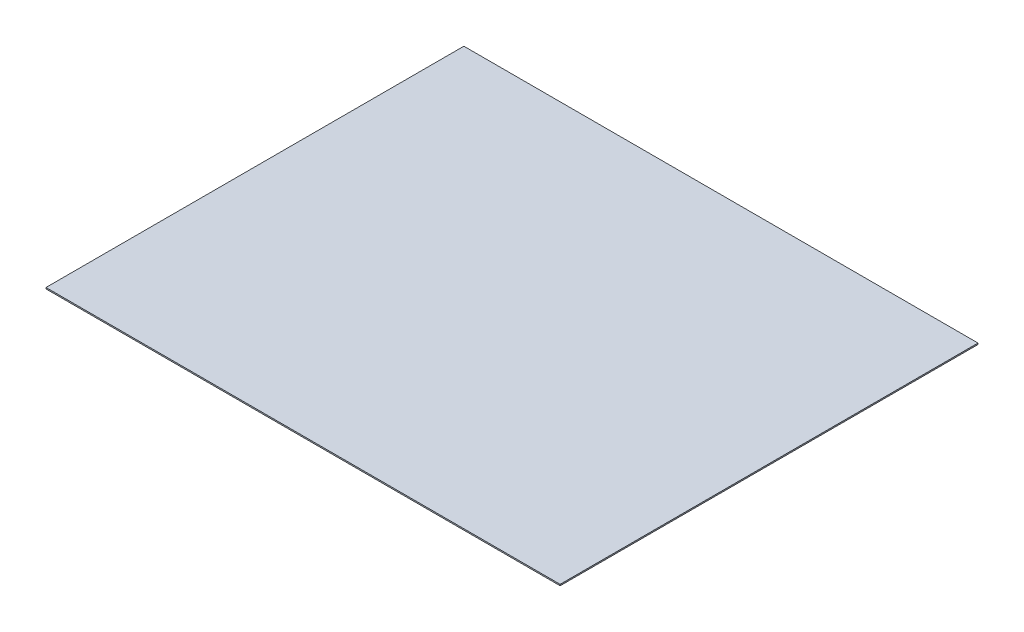
ISO-10303-21;
HEADER;
FILE_DESCRIPTION(('STEP AP214'),'2;1');
FILE_NAME('part.step','',(''),(''),'','','');
FILE_SCHEMA(('AUTOMOTIVE_DESIGN { 1 0 10303 214 1 1 1 1 }'));
ENDSEC;
DATA;
#1=APPLICATION_CONTEXT('core data for automotive mechanical design processes');
#2=APPLICATION_PROTOCOL_DEFINITION('international standard','automotive_design',2000,#1);
#3=PRODUCT_CONTEXT('',#1,'mechanical');
#4=PRODUCT('Part','Part','',(#3));
#5=PRODUCT_RELATED_PRODUCT_CATEGORY('part','',(#4));
#6=PRODUCT_DEFINITION_FORMATION('','',#4);
#7=PRODUCT_DEFINITION_CONTEXT('part definition',#1,'design');
#8=PRODUCT_DEFINITION('design','',#6,#7);
#9=PRODUCT_DEFINITION_SHAPE('','',#8);
#10=(LENGTH_UNIT() NAMED_UNIT(*) SI_UNIT(.MILLI.,.METRE.));
#11=(NAMED_UNIT(*) PLANE_ANGLE_UNIT() SI_UNIT($,.RADIAN.));
#12=(NAMED_UNIT(*) SI_UNIT($,.STERADIAN.) SOLID_ANGLE_UNIT());
#13=UNCERTAINTY_MEASURE_WITH_UNIT(LENGTH_MEASURE(1.E-05),#10,'distance_accuracy_value','');
#14=(GEOMETRIC_REPRESENTATION_CONTEXT(3) GLOBAL_UNCERTAINTY_ASSIGNED_CONTEXT((#13)) GLOBAL_UNIT_ASSIGNED_CONTEXT((#10,
#11,#12)) REPRESENTATION_CONTEXT('',''));
#15=CARTESIAN_POINT('',(0.,0.,0.));
#16=DIRECTION('',(0.,0.,1.));
#17=DIRECTION('',(1.,0.,0.));
#18=AXIS2_PLACEMENT_3D('',#15,#16,#17);
#19=CARTESIAN_POINT('',(0.,1.5875,0.));
#20=DIRECTION('',(1.,0.,0.));
#21=DIRECTION('',(0.,0.,-1.));
#22=AXIS2_PLACEMENT_3D('',#19,#20,#21);
#23=PLANE('',#22);
#24=DIRECTION('',(0.,0.,1.));
#25=VECTOR('',#24,1.);
#26=CARTESIAN_POINT('',(0.,0.,0.));
#27=LINE('',#26,#25);
#28=CARTESIAN_POINT('',(0.,0.,-508.46228));
#29=VERTEX_POINT('',#28);
#30=CARTESIAN_POINT('',(0.,0.,0.));
#31=VERTEX_POINT('',#30);
#32=EDGE_CURVE('E96',#29,#31,#27,.T.);
#33=ORIENTED_EDGE('',*,*,#32,.T.);
#34=DIRECTION('',(0.,-1.,0.));
#35=VECTOR('',#34,1.);
#36=CARTESIAN_POINT('',(0.,1.5875,0.));
#37=LINE('',#36,#35);
#38=CARTESIAN_POINT('',(0.,1.5875,0.));
#39=VERTEX_POINT('',#38);
#40=EDGE_CURVE('E11',#39,#31,#37,.T.);
#41=ORIENTED_EDGE('',*,*,#40,.F.);
#42=DIRECTION('',(0.,0.,1.));
#43=VECTOR('',#42,1.);
#44=CARTESIAN_POINT('',(0.,1.5875,0.));
#45=LINE('',#44,#43);
#46=CARTESIAN_POINT('',(0.,1.5875,-508.46228));
#47=VERTEX_POINT('',#46);
#48=EDGE_CURVE('E84',#47,#39,#45,.T.);
#49=ORIENTED_EDGE('',*,*,#48,.F.);
#50=DIRECTION('',(0.,-1.,0.));
#51=VECTOR('',#50,1.);
#52=CARTESIAN_POINT('',(0.,1.5875,-508.46228));
#53=LINE('',#52,#51);
#54=EDGE_CURVE('E92',#47,#29,#53,.T.);
#55=ORIENTED_EDGE('',*,*,#54,.T.);
#56=EDGE_LOOP('',(#33,#41,#49,#55));
#57=FACE_BOUND('',#56,.T.);
#58=ADVANCED_FACE('F33',(#57),#23,.F.);
#59=CARTESIAN_POINT('',(0.,1.5875,0.));
#60=DIRECTION('',(0.,0.,-1.));
#61=DIRECTION('',(-1.,0.,0.));
#62=AXIS2_PLACEMENT_3D('',#59,#60,#61);
#63=PLANE('',#62);
#64=DIRECTION('',(1.,0.,0.));
#65=VECTOR('',#64,1.);
#66=CARTESIAN_POINT('',(0.,0.,0.));
#67=LINE('',#66,#65);
#68=CARTESIAN_POINT('',(625.602,0.,0.));
#69=VERTEX_POINT('',#68);
#70=EDGE_CURVE('E88',#31,#69,#67,.T.);
#71=ORIENTED_EDGE('',*,*,#70,.T.);
#72=DIRECTION('',(0.,-1.,0.));
#73=VECTOR('',#72,1.);
#74=CARTESIAN_POINT('',(625.602,1.5875,0.));
#75=LINE('',#74,#73);
#76=CARTESIAN_POINT('',(625.602,1.5875,0.));
#77=VERTEX_POINT('',#76);
#78=EDGE_CURVE('E41',#77,#69,#75,.T.);
#79=ORIENTED_EDGE('',*,*,#78,.F.);
#80=DIRECTION('',(1.,0.,0.));
#81=VECTOR('',#80,1.);
#82=CARTESIAN_POINT('',(0.,1.5875,0.));
#83=LINE('',#82,#81);
#84=EDGE_CURVE('E79',#39,#77,#83,.T.);
#85=ORIENTED_EDGE('',*,*,#84,.F.);
#86=ORIENTED_EDGE('',*,*,#40,.T.);
#87=EDGE_LOOP('',(#71,#79,#85,#86));
#88=FACE_BOUND('',#87,.T.);
#89=ADVANCED_FACE('F87',(#88),#63,.F.);
#90=CARTESIAN_POINT('',(625.602,1.5875,0.));
#91=DIRECTION('',(-1.,0.,0.));
#92=DIRECTION('',(0.,0.,1.));
#93=AXIS2_PLACEMENT_3D('',#90,#91,#92);
#94=PLANE('',#93);
#95=DIRECTION('',(0.,0.,-1.));
#96=VECTOR('',#95,1.);
#97=CARTESIAN_POINT('',(625.602,0.,0.));
#98=LINE('',#97,#96);
#99=CARTESIAN_POINT('',(625.602,0.,-508.46228));
#100=VERTEX_POINT('',#99);
#101=EDGE_CURVE('E66',#69,#100,#98,.T.);
#102=ORIENTED_EDGE('',*,*,#101,.T.);
#103=DIRECTION('',(0.,-1.,0.));
#104=VECTOR('',#103,1.);
#105=CARTESIAN_POINT('',(625.602,1.5875,-508.46228));
#106=LINE('',#105,#104);
#107=CARTESIAN_POINT('',(625.602,1.5875,-508.46228));
#108=VERTEX_POINT('',#107);
#109=EDGE_CURVE('E89',#108,#100,#106,.T.);
#110=ORIENTED_EDGE('',*,*,#109,.F.);
#111=DIRECTION('',(0.,0.,-1.));
#112=VECTOR('',#111,1.);
#113=CARTESIAN_POINT('',(625.602,1.5875,0.));
#114=LINE('',#113,#112);
#115=EDGE_CURVE('E82',#77,#108,#114,.T.);
#116=ORIENTED_EDGE('',*,*,#115,.F.);
#117=ORIENTED_EDGE('',*,*,#78,.T.);
#118=EDGE_LOOP('',(#102,#110,#116,#117));
#119=FACE_BOUND('',#118,.T.);
#120=ADVANCED_FACE('F90',(#119),#94,.F.);
#121=CARTESIAN_POINT('',(0.,1.5875,-508.46228));
#122=DIRECTION('',(0.,0.,1.));
#123=DIRECTION('',(1.,0.,0.));
#124=AXIS2_PLACEMENT_3D('',#121,#122,#123);
#125=PLANE('',#124);
#126=DIRECTION('',(-1.,0.,0.));
#127=VECTOR('',#126,1.);
#128=CARTESIAN_POINT('',(0.,0.,-508.46228));
#129=LINE('',#128,#127);
#130=EDGE_CURVE('E72',#100,#29,#129,.T.);
#131=ORIENTED_EDGE('',*,*,#130,.T.);
#132=ORIENTED_EDGE('',*,*,#54,.F.);
#133=DIRECTION('',(-1.,0.,0.));
#134=VECTOR('',#133,1.);
#135=CARTESIAN_POINT('',(0.,1.5875,-508.46228));
#136=LINE('',#135,#134);
#137=EDGE_CURVE('E49',#108,#47,#136,.T.);
#138=ORIENTED_EDGE('',*,*,#137,.F.);
#139=ORIENTED_EDGE('',*,*,#109,.T.);
#140=EDGE_LOOP('',(#131,#132,#138,#139));
#141=FACE_BOUND('',#140,.T.);
#142=ADVANCED_FACE('F103',(#141),#125,.F.);
#143=CARTESIAN_POINT('',(0.,1.5875,0.));
#144=DIRECTION('',(0.,-1.,0.));
#145=DIRECTION('',(0.,0.,-1.));
#146=AXIS2_PLACEMENT_3D('',#143,#144,#145);
#147=PLANE('',#146);
#148=ORIENTED_EDGE('',*,*,#48,.T.);
#149=ORIENTED_EDGE('',*,*,#84,.T.);
#150=ORIENTED_EDGE('',*,*,#115,.T.);
#151=ORIENTED_EDGE('',*,*,#137,.T.);
#152=EDGE_LOOP('',(#148,#149,#150,#151));
#153=FACE_BOUND('',#152,.T.);
#154=ADVANCED_FACE('F80',(#153),#147,.F.);
#155=CARTESIAN_POINT('',(0.,0.,0.));
#156=DIRECTION('',(0.,-1.,0.));
#157=DIRECTION('',(0.,0.,-1.));
#158=AXIS2_PLACEMENT_3D('',#155,#156,#157);
#159=PLANE('',#158);
#160=ORIENTED_EDGE('',*,*,#32,.F.);
#161=ORIENTED_EDGE('',*,*,#130,.F.);
#162=ORIENTED_EDGE('',*,*,#101,.F.);
#163=ORIENTED_EDGE('',*,*,#70,.F.);
#164=EDGE_LOOP('',(#160,#161,#162,#163));
#165=FACE_BOUND('',#164,.T.);
#166=ADVANCED_FACE('F106',(#165),#159,.T.);
#167=CLOSED_SHELL('',(#58,#89,#120,#142,#154,#166));
#168=MANIFOLD_SOLID_BREP('B2',#167);
#169=ADVANCED_BREP_SHAPE_REPRESENTATION('',(#18,#168),#14);
#170=SHAPE_DEFINITION_REPRESENTATION(#9,#169);
ENDSEC;
END-ISO-10303-21;
